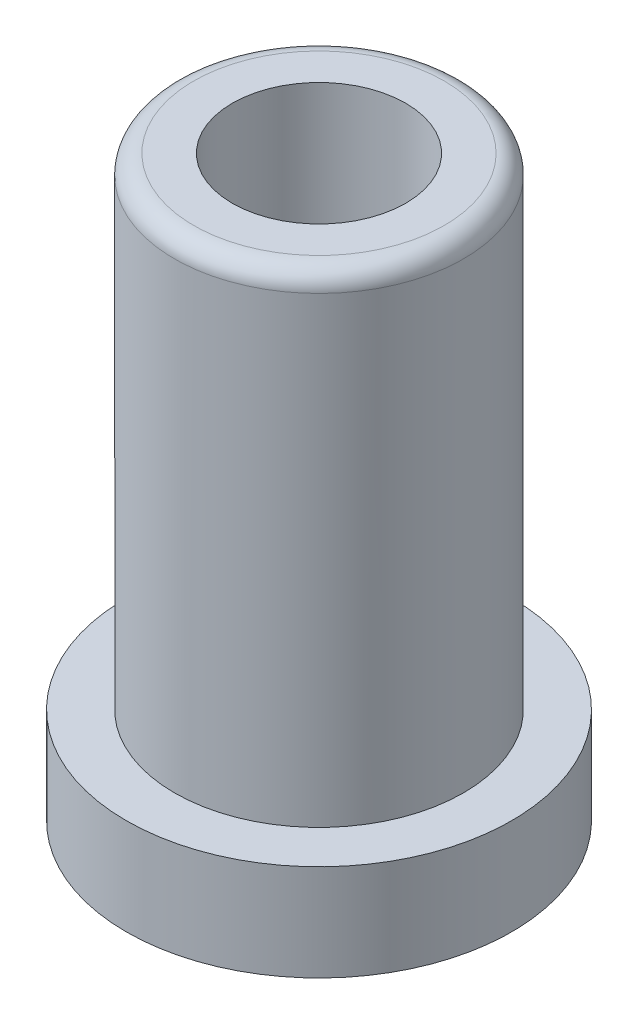
ISO-10303-21;
HEADER;
FILE_DESCRIPTION(('STEP AP214'),'2;1');
FILE_NAME('part.step','',(''),(''),'','','');
FILE_SCHEMA(('AUTOMOTIVE_DESIGN { 1 0 10303 214 1 1 1 1 }'));
ENDSEC;
DATA;
#1=APPLICATION_CONTEXT('core data for automotive mechanical design processes');
#2=APPLICATION_PROTOCOL_DEFINITION('international standard','automotive_design',2000,#1);
#3=PRODUCT_CONTEXT('',#1,'mechanical');
#4=PRODUCT('Part','Part','',(#3));
#5=PRODUCT_RELATED_PRODUCT_CATEGORY('part','',(#4));
#6=PRODUCT_DEFINITION_FORMATION('','',#4);
#7=PRODUCT_DEFINITION_CONTEXT('part definition',#1,'design');
#8=PRODUCT_DEFINITION('design','',#6,#7);
#9=PRODUCT_DEFINITION_SHAPE('','',#8);
#10=(LENGTH_UNIT() NAMED_UNIT(*) SI_UNIT(.MILLI.,.METRE.));
#11=(NAMED_UNIT(*) PLANE_ANGLE_UNIT() SI_UNIT($,.RADIAN.));
#12=(NAMED_UNIT(*) SI_UNIT($,.STERADIAN.) SOLID_ANGLE_UNIT());
#13=UNCERTAINTY_MEASURE_WITH_UNIT(LENGTH_MEASURE(1.E-05),#10,'distance_accuracy_value','');
#14=(GEOMETRIC_REPRESENTATION_CONTEXT(3) GLOBAL_UNCERTAINTY_ASSIGNED_CONTEXT((#13)) GLOBAL_UNIT_ASSIGNED_CONTEXT((#10,
#11,#12)) REPRESENTATION_CONTEXT('',''));
#15=CARTESIAN_POINT('',(0.,0.,0.));
#16=DIRECTION('',(0.,0.,1.));
#17=DIRECTION('',(1.,0.,0.));
#18=AXIS2_PLACEMENT_3D('',#15,#16,#17);
#19=CARTESIAN_POINT('',(0.,0.5,0.));
#20=DIRECTION('',(0.,-1.,0.));
#21=DIRECTION('',(0.,0.,-1.));
#22=AXIS2_PLACEMENT_3D('',#19,#20,#21);
#23=CYLINDRICAL_SURFACE('',#22,1.);
#24=CARTESIAN_POINT('',(0.,0.5,0.));
#25=DIRECTION('',(0.,1.,0.));
#26=DIRECTION('',(0.,0.,1.));
#27=AXIS2_PLACEMENT_3D('',#24,#25,#26);
#28=CIRCLE('',#27,1.);
#29=CARTESIAN_POINT('',(0.,0.5,1.));
#30=VERTEX_POINT('',#29);
#31=EDGE_CURVE('E55',#30,#30,#28,.T.);
#32=ORIENTED_EDGE('',*,*,#31,.F.);
#33=EDGE_LOOP('',(#32));
#34=FACE_BOUND('',#33,.T.);
#35=CARTESIAN_POINT('',(0.,0.,0.));
#36=DIRECTION('',(0.,1.,0.));
#37=DIRECTION('',(0.,0.,1.));
#38=AXIS2_PLACEMENT_3D('',#35,#36,#37);
#39=CIRCLE('',#38,1.);
#40=CARTESIAN_POINT('',(0.,0.,1.));
#41=VERTEX_POINT('',#40);
#42=EDGE_CURVE('E58',#41,#41,#39,.T.);
#43=ORIENTED_EDGE('',*,*,#42,.T.);
#44=EDGE_LOOP('',(#43));
#45=FACE_BOUND('',#44,.T.);
#46=ADVANCED_FACE('F37',(#34,#45),#23,.T.);
#47=CARTESIAN_POINT('',(0.,0.5,0.));
#48=DIRECTION('',(0.,1.,0.));
#49=DIRECTION('',(0.,0.,1.));
#50=AXIS2_PLACEMENT_3D('',#47,#48,#49);
#51=PLANE('',#50);
#52=CARTESIAN_POINT('',(0.,0.5,0.));
#53=DIRECTION('',(0.,1.,0.));
#54=DIRECTION('',(0.,0.,1.));
#55=AXIS2_PLACEMENT_3D('',#52,#53,#54);
#56=CIRCLE('',#55,0.75);
#57=CARTESIAN_POINT('',(0.,0.5,0.75));
#58=VERTEX_POINT('',#57);
#59=EDGE_CURVE('E50',#58,#58,#56,.T.);
#60=ORIENTED_EDGE('',*,*,#59,.F.);
#61=EDGE_LOOP('',(#60));
#62=FACE_BOUND('',#61,.T.);
#63=ORIENTED_EDGE('',*,*,#31,.T.);
#64=EDGE_LOOP('',(#63));
#65=FACE_BOUND('',#64,.T.);
#66=ADVANCED_FACE('F89',(#62,#65),#51,.T.);
#67=CARTESIAN_POINT('',(0.,0.,0.));
#68=DIRECTION('',(0.,1.,0.));
#69=DIRECTION('',(0.,0.,1.));
#70=AXIS2_PLACEMENT_3D('',#67,#68,#69);
#71=PLANE('',#70);
#72=ORIENTED_EDGE('',*,*,#42,.F.);
#73=EDGE_LOOP('',(#72));
#74=FACE_BOUND('',#73,.T.);
#75=ADVANCED_FACE('F85',(#74),#71,.F.);
#76=CARTESIAN_POINT('',(0.,3.,0.));
#77=DIRECTION('',(0.,-1.,0.));
#78=DIRECTION('',(0.,0.,-1.));
#79=AXIS2_PLACEMENT_3D('',#76,#77,#78);
#80=CYLINDRICAL_SURFACE('',#79,0.75);
#81=CARTESIAN_POINT('',(0.,2.9,0.));
#82=DIRECTION('',(0.,-1.,0.));
#83=DIRECTION('',(0.,0.,-1.));
#84=AXIS2_PLACEMENT_3D('',#81,#82,#83);
#85=CIRCLE('',#84,0.75);
#86=CARTESIAN_POINT('',(0.,2.9,-0.75));
#87=VERTEX_POINT('',#86);
#88=EDGE_CURVE('E45',#87,#87,#85,.T.);
#89=ORIENTED_EDGE('',*,*,#88,.T.);
#90=EDGE_LOOP('',(#89));
#91=FACE_BOUND('',#90,.T.);
#92=ORIENTED_EDGE('',*,*,#59,.T.);
#93=EDGE_LOOP('',(#92));
#94=FACE_BOUND('',#93,.T.);
#95=ADVANCED_FACE('F78',(#91,#94),#80,.T.);
#96=CARTESIAN_POINT('',(0.,3.,0.));
#97=DIRECTION('',(0.,-1.,0.));
#98=DIRECTION('',(0.,0.,-1.));
#99=AXIS2_PLACEMENT_3D('',#96,#97,#98);
#100=PLANE('',#99);
#101=CARTESIAN_POINT('',(0.,3.,0.));
#102=DIRECTION('',(0.,1.,0.));
#103=DIRECTION('',(0.,0.,1.));
#104=AXIS2_PLACEMENT_3D('',#101,#102,#103);
#105=CIRCLE('',#104,0.45);
#106=CARTESIAN_POINT('',(0.,3.,0.45));
#107=VERTEX_POINT('',#106);
#108=EDGE_CURVE('E69',#107,#107,#105,.T.);
#109=ORIENTED_EDGE('',*,*,#108,.F.);
#110=EDGE_LOOP('',(#109));
#111=FACE_BOUND('',#110,.T.);
#112=CARTESIAN_POINT('',(0.,3.,0.));
#113=DIRECTION('',(0.,-1.,0.));
#114=DIRECTION('',(0.,0.,-1.));
#115=AXIS2_PLACEMENT_3D('',#112,#113,#114);
#116=CIRCLE('',#115,0.65);
#117=CARTESIAN_POINT('',(0.,3.,-0.65));
#118=VERTEX_POINT('',#117);
#119=EDGE_CURVE('E10',#118,#118,#116,.F.);
#120=ORIENTED_EDGE('',*,*,#119,.T.);
#121=EDGE_LOOP('',(#120));
#122=FACE_BOUND('',#121,.T.);
#123=ADVANCED_FACE('F76',(#111,#122),#100,.F.);
#124=CARTESIAN_POINT('',(0.,2.9,0.));
#125=DIRECTION('',(0.,-1.,0.));
#126=DIRECTION('',(0.,0.,-1.));
#127=AXIS2_PLACEMENT_3D('',#124,#125,#126);
#128=TOROIDAL_SURFACE('',#127,0.65,0.1);
#129=ORIENTED_EDGE('',*,*,#119,.F.);
#130=EDGE_LOOP('',(#129));
#131=FACE_BOUND('',#130,.T.);
#132=ORIENTED_EDGE('',*,*,#88,.F.);
#133=EDGE_LOOP('',(#132));
#134=FACE_BOUND('',#133,.T.);
#135=ADVANCED_FACE('F39',(#131,#134),#128,.T.);
#136=CARTESIAN_POINT('',(0.,-0.772792206135786,0.));
#137=DIRECTION('',(0.,1.,0.));
#138=DIRECTION('',(0.,0.,1.));
#139=AXIS2_PLACEMENT_3D('',#136,#137,#138);
#140=CYLINDRICAL_SURFACE('',#139,0.45);
#141=CARTESIAN_POINT('',(0.,0.5,0.));
#142=DIRECTION('',(0.,1.,0.));
#143=DIRECTION('',(0.,0.,1.));
#144=AXIS2_PLACEMENT_3D('',#141,#142,#143);
#145=CIRCLE('',#144,0.45);
#146=CARTESIAN_POINT('',(0.,0.5,0.45));
#147=VERTEX_POINT('',#146);
#148=EDGE_CURVE('E62',#147,#147,#145,.F.);
#149=ORIENTED_EDGE('',*,*,#148,.T.);
#150=EDGE_LOOP('',(#149));
#151=FACE_BOUND('',#150,.T.);
#152=ORIENTED_EDGE('',*,*,#108,.T.);
#153=EDGE_LOOP('',(#152));
#154=FACE_BOUND('',#153,.T.);
#155=ADVANCED_FACE('F74',(#151,#154),#140,.F.);
#156=CARTESIAN_POINT('',(0.,0.5,0.));
#157=DIRECTION('',(0.,1.,0.));
#158=DIRECTION('',(0.,0.,1.));
#159=AXIS2_PLACEMENT_3D('',#156,#157,#158);
#160=PLANE('',#159);
#161=ORIENTED_EDGE('',*,*,#148,.F.);
#162=EDGE_LOOP('',(#161));
#163=FACE_BOUND('',#162,.T.);
#164=ADVANCED_FACE('F129',(#163),#160,.T.);
#165=CLOSED_SHELL('',(#46,#66,#75,#95,#123,#135,#155,#164));
#166=MANIFOLD_SOLID_BREP('B2',#165);
#167=ADVANCED_BREP_SHAPE_REPRESENTATION('',(#18,#166),#14);
#168=SHAPE_DEFINITION_REPRESENTATION(#9,#167);
ENDSEC;
END-ISO-10303-21;
